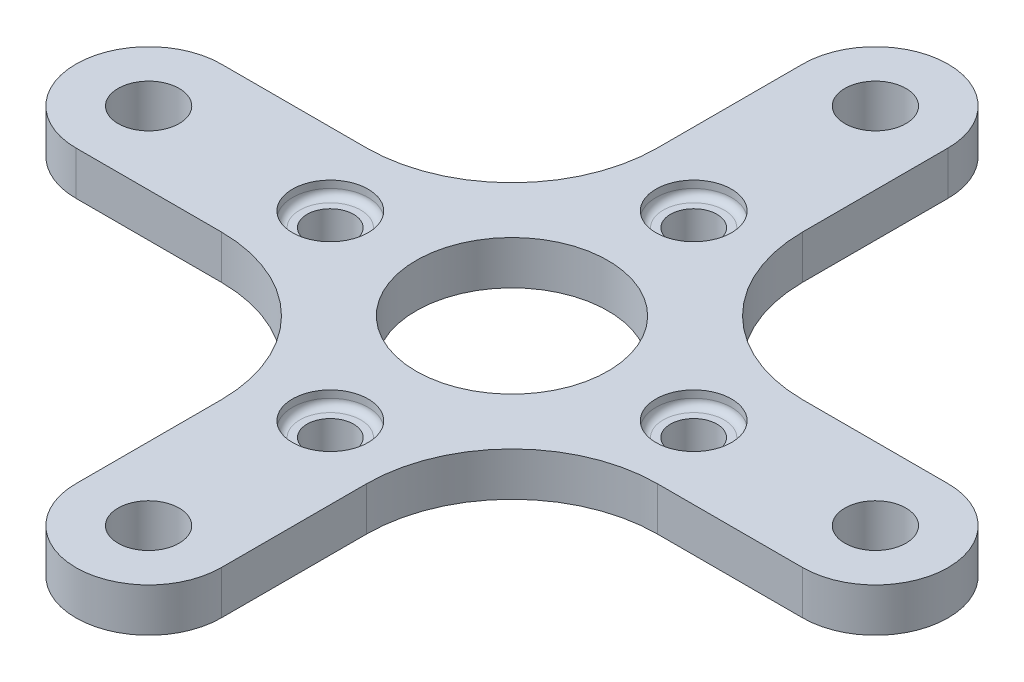
ISO-10303-21;
HEADER;
FILE_DESCRIPTION(('STEP AP214'),'2;1');
FILE_NAME('part.step','',(''),(''),'','','');
FILE_SCHEMA(('AUTOMOTIVE_DESIGN { 1 0 10303 214 1 1 1 1 }'));
ENDSEC;
DATA;
#1=APPLICATION_CONTEXT('core data for automotive mechanical design processes');
#2=APPLICATION_PROTOCOL_DEFINITION('international standard','automotive_design',2000,#1);
#3=PRODUCT_CONTEXT('',#1,'mechanical');
#4=PRODUCT('Part','Part','',(#3));
#5=PRODUCT_RELATED_PRODUCT_CATEGORY('part','',(#4));
#6=PRODUCT_DEFINITION_FORMATION('','',#4);
#7=PRODUCT_DEFINITION_CONTEXT('part definition',#1,'design');
#8=PRODUCT_DEFINITION('design','',#6,#7);
#9=PRODUCT_DEFINITION_SHAPE('','',#8);
#10=(LENGTH_UNIT() NAMED_UNIT(*) SI_UNIT(.MILLI.,.METRE.));
#11=(NAMED_UNIT(*) PLANE_ANGLE_UNIT() SI_UNIT($,.RADIAN.));
#12=(NAMED_UNIT(*) SI_UNIT($,.STERADIAN.) SOLID_ANGLE_UNIT());
#13=UNCERTAINTY_MEASURE_WITH_UNIT(LENGTH_MEASURE(1.E-05),#10,'distance_accuracy_value','');
#14=(GEOMETRIC_REPRESENTATION_CONTEXT(3) GLOBAL_UNCERTAINTY_ASSIGNED_CONTEXT((#13)) GLOBAL_UNIT_ASSIGNED_CONTEXT((#10,
#11,#12)) REPRESENTATION_CONTEXT('',''));
#15=CARTESIAN_POINT('',(0.,0.,0.));
#16=DIRECTION('',(0.,0.,1.));
#17=DIRECTION('',(1.,0.,0.));
#18=AXIS2_PLACEMENT_3D('',#15,#16,#17);
#19=CARTESIAN_POINT('',(0.,3.,-12.5));
#20=DIRECTION('',(0.,-1.,0.));
#21=DIRECTION('',(0.,0.,-1.));
#22=AXIS2_PLACEMENT_3D('',#19,#20,#21);
#23=CYLINDRICAL_SURFACE('',#22,1.6);
#24=CARTESIAN_POINT('',(0.,0.,-12.5));
#25=DIRECTION('',(0.,1.,0.));
#26=DIRECTION('',(0.,0.,1.));
#27=AXIS2_PLACEMENT_3D('',#24,#25,#26);
#28=CIRCLE('',#27,1.6);
#29=CARTESIAN_POINT('',(0.,0.,-10.9));
#30=VERTEX_POINT('',#29);
#31=EDGE_CURVE('E268',#30,#30,#28,.T.);
#32=ORIENTED_EDGE('',*,*,#31,.F.);
#33=EDGE_LOOP('',(#32));
#34=FACE_BOUND('',#33,.T.);
#35=CARTESIAN_POINT('',(0.,2.,-12.5));
#36=DIRECTION('',(0.,1.,0.));
#37=DIRECTION('',(0.,0.,1.));
#38=AXIS2_PLACEMENT_3D('',#35,#36,#37);
#39=CIRCLE('',#38,1.6);
#40=CARTESIAN_POINT('',(0.,2.,-10.9));
#41=VERTEX_POINT('',#40);
#42=EDGE_CURVE('E454',#41,#41,#39,.T.);
#43=ORIENTED_EDGE('',*,*,#42,.T.);
#44=EDGE_LOOP('',(#43));
#45=FACE_BOUND('',#44,.T.);
#46=ADVANCED_FACE('F41',(#34,#45),#23,.F.);
#47=CARTESIAN_POINT('',(12.5,3.,0.));
#48=DIRECTION('',(0.,-1.,0.));
#49=DIRECTION('',(0.,0.,-1.));
#50=AXIS2_PLACEMENT_3D('',#47,#48,#49);
#51=CYLINDRICAL_SURFACE('',#50,1.6);
#52=CARTESIAN_POINT('',(12.5,0.,0.));
#53=DIRECTION('',(0.,1.,0.));
#54=DIRECTION('',(0.,0.,1.));
#55=AXIS2_PLACEMENT_3D('',#52,#53,#54);
#56=CIRCLE('',#55,1.6);
#57=CARTESIAN_POINT('',(12.5,0.,1.60000000000004));
#58=VERTEX_POINT('',#57);
#59=EDGE_CURVE('E265',#58,#58,#56,.T.);
#60=ORIENTED_EDGE('',*,*,#59,.F.);
#61=EDGE_LOOP('',(#60));
#62=FACE_BOUND('',#61,.T.);
#63=CARTESIAN_POINT('',(12.5,2.,0.));
#64=DIRECTION('',(0.,1.,0.));
#65=DIRECTION('',(0.,0.,1.));
#66=AXIS2_PLACEMENT_3D('',#63,#64,#65);
#67=CIRCLE('',#66,1.6);
#68=CARTESIAN_POINT('',(12.5,2.,1.60000000000004));
#69=VERTEX_POINT('',#68);
#70=EDGE_CURVE('E452',#69,#69,#67,.T.);
#71=ORIENTED_EDGE('',*,*,#70,.T.);
#72=EDGE_LOOP('',(#71));
#73=FACE_BOUND('',#72,.T.);
#74=ADVANCED_FACE('F334',(#62,#73),#51,.F.);
#75=CARTESIAN_POINT('',(0.,3.,12.5));
#76=DIRECTION('',(0.,-1.,0.));
#77=DIRECTION('',(0.,0.,-1.));
#78=AXIS2_PLACEMENT_3D('',#75,#76,#77);
#79=CYLINDRICAL_SURFACE('',#78,1.6);
#80=CARTESIAN_POINT('',(0.,0.,12.5));
#81=DIRECTION('',(0.,1.,0.));
#82=DIRECTION('',(0.,0.,1.));
#83=AXIS2_PLACEMENT_3D('',#80,#81,#82);
#84=CIRCLE('',#83,1.6);
#85=CARTESIAN_POINT('',(0.,0.,14.1));
#86=VERTEX_POINT('',#85);
#87=EDGE_CURVE('E262',#86,#86,#84,.T.);
#88=ORIENTED_EDGE('',*,*,#87,.F.);
#89=EDGE_LOOP('',(#88));
#90=FACE_BOUND('',#89,.T.);
#91=CARTESIAN_POINT('',(0.,2.,12.5));
#92=DIRECTION('',(0.,1.,0.));
#93=DIRECTION('',(0.,0.,1.));
#94=AXIS2_PLACEMENT_3D('',#91,#92,#93);
#95=CIRCLE('',#94,1.6);
#96=CARTESIAN_POINT('',(0.,2.,14.1));
#97=VERTEX_POINT('',#96);
#98=EDGE_CURVE('E460',#97,#97,#95,.T.);
#99=ORIENTED_EDGE('',*,*,#98,.T.);
#100=EDGE_LOOP('',(#99));
#101=FACE_BOUND('',#100,.T.);
#102=ADVANCED_FACE('F341',(#90,#101),#79,.F.);
#103=CARTESIAN_POINT('',(-12.5,3.,-1.30930550206618E-13));
#104=DIRECTION('',(0.,-1.,0.));
#105=DIRECTION('',(0.,0.,-1.));
#106=AXIS2_PLACEMENT_3D('',#103,#104,#105);
#107=CYLINDRICAL_SURFACE('',#106,1.6);
#108=CARTESIAN_POINT('',(-12.5,0.,-1.30930550206618E-13));
#109=DIRECTION('',(0.,1.,0.));
#110=DIRECTION('',(0.,0.,1.));
#111=AXIS2_PLACEMENT_3D('',#108,#109,#110);
#112=CIRCLE('',#111,1.6);
#113=CARTESIAN_POINT('',(-12.5,0.,1.59999999999987));
#114=VERTEX_POINT('',#113);
#115=EDGE_CURVE('E259',#114,#114,#112,.T.);
#116=ORIENTED_EDGE('',*,*,#115,.F.);
#117=EDGE_LOOP('',(#116));
#118=FACE_BOUND('',#117,.T.);
#119=CARTESIAN_POINT('',(-12.5,2.,-1.30930550206618E-13));
#120=DIRECTION('',(0.,1.,0.));
#121=DIRECTION('',(0.,0.,1.));
#122=AXIS2_PLACEMENT_3D('',#119,#120,#121);
#123=CIRCLE('',#122,1.6);
#124=CARTESIAN_POINT('',(-12.5,2.,1.59999999999987));
#125=VERTEX_POINT('',#124);
#126=EDGE_CURVE('E467',#125,#125,#123,.T.);
#127=ORIENTED_EDGE('',*,*,#126,.T.);
#128=EDGE_LOOP('',(#127));
#129=FACE_BOUND('',#128,.T.);
#130=ADVANCED_FACE('F352',(#118,#129),#107,.F.);
#131=CARTESIAN_POINT('',(-24.999999999997,3.,1.8580927577482E-12));
#132=DIRECTION('',(0.,-1.,0.));
#133=DIRECTION('',(0.,0.,-1.));
#134=AXIS2_PLACEMENT_3D('',#131,#132,#133);
#135=CYLINDRICAL_SURFACE('',#134,5.);
#136=CARTESIAN_POINT('',(-24.999999999997,0.,1.8580927577482E-12));
#137=DIRECTION('',(0.,1.,0.));
#138=DIRECTION('',(0.,0.,1.));
#139=AXIS2_PLACEMENT_3D('',#136,#137,#138);
#140=CIRCLE('',#139,5.);
#141=CARTESIAN_POINT('',(-24.999999999997,0.,5.00000000000186));
#142=VERTEX_POINT('',#141);
#143=CARTESIAN_POINT('',(-24.999999999997,0.,-4.99999999999814));
#144=VERTEX_POINT('',#143);
#145=EDGE_CURVE('E202',#142,#144,#140,.F.);
#146=ORIENTED_EDGE('',*,*,#145,.F.);
#147=DIRECTION('',(0.,-1.,0.));
#148=VECTOR('',#147,1.);
#149=CARTESIAN_POINT('',(-24.999999999997,3.,5.00000000000186));
#150=LINE('',#149,#148);
#151=CARTESIAN_POINT('',(-24.999999999997,3.,5.00000000000186));
#152=VERTEX_POINT('',#151);
#153=EDGE_CURVE('E118',#152,#142,#150,.T.);
#154=ORIENTED_EDGE('',*,*,#153,.F.);
#155=CARTESIAN_POINT('',(-24.999999999997,3.,1.8580927577482E-12));
#156=DIRECTION('',(0.,1.,0.));
#157=DIRECTION('',(0.,0.,1.));
#158=AXIS2_PLACEMENT_3D('',#155,#156,#157);
#159=CIRCLE('',#158,5.);
#160=CARTESIAN_POINT('',(-24.999999999997,3.,-4.99999999999814));
#161=VERTEX_POINT('',#160);
#162=EDGE_CURVE('E274',#152,#161,#159,.F.);
#163=ORIENTED_EDGE('',*,*,#162,.T.);
#164=DIRECTION('',(0.,-1.,0.));
#165=VECTOR('',#164,1.);
#166=CARTESIAN_POINT('',(-24.999999999997,3.,-4.99999999999814));
#167=LINE('',#166,#165);
#168=EDGE_CURVE('E58',#161,#144,#167,.T.);
#169=ORIENTED_EDGE('',*,*,#168,.T.);
#170=EDGE_LOOP('',(#146,#154,#163,#169));
#171=FACE_BOUND('',#170,.T.);
#172=ADVANCED_FACE('F356',(#171),#135,.T.);
#173=CARTESIAN_POINT('',(0.,3.,5.00000000000186));
#174=DIRECTION('',(0.,0.,-1.));
#175=DIRECTION('',(-1.,0.,0.));
#176=AXIS2_PLACEMENT_3D('',#173,#174,#175);
#177=PLANE('',#176);
#178=DIRECTION('',(1.,0.,0.));
#179=VECTOR('',#178,1.);
#180=CARTESIAN_POINT('',(0.,0.,5.00000000000186));
#181=LINE('',#180,#179);
#182=CARTESIAN_POINT('',(-14.999999999997,0.,5.00000000000186));
#183=VERTEX_POINT('',#182);
#184=EDGE_CURVE('E204',#142,#183,#181,.T.);
#185=ORIENTED_EDGE('',*,*,#184,.T.);
#186=DIRECTION('',(0.,-1.,0.));
#187=VECTOR('',#186,1.);
#188=CARTESIAN_POINT('',(-14.999999999997,3.,5.00000000000186));
#189=LINE('',#188,#187);
#190=CARTESIAN_POINT('',(-14.999999999997,3.,5.00000000000186));
#191=VERTEX_POINT('',#190);
#192=EDGE_CURVE('E298',#191,#183,#189,.T.);
#193=ORIENTED_EDGE('',*,*,#192,.F.);
#194=DIRECTION('',(1.,0.,0.));
#195=VECTOR('',#194,1.);
#196=CARTESIAN_POINT('',(0.,3.,5.00000000000186));
#197=LINE('',#196,#195);
#198=EDGE_CURVE('E476',#152,#191,#197,.T.);
#199=ORIENTED_EDGE('',*,*,#198,.F.);
#200=ORIENTED_EDGE('',*,*,#153,.T.);
#201=EDGE_LOOP('',(#185,#193,#199,#200));
#202=FACE_BOUND('',#201,.T.);
#203=ADVANCED_FACE('F424',(#202),#177,.F.);
#204=CARTESIAN_POINT('',(-14.9999999999953,3.,14.9999999999989));
#205=DIRECTION('',(0.,-1.,0.));
#206=DIRECTION('',(0.,0.,-1.));
#207=AXIS2_PLACEMENT_3D('',#204,#205,#206);
#208=CYLINDRICAL_SURFACE('',#207,10.0000000000002);
#209=CARTESIAN_POINT('',(-14.9999999999953,0.,14.9999999999989));
#210=DIRECTION('',(0.,1.,0.));
#211=DIRECTION('',(0.,0.,1.));
#212=AXIS2_PLACEMENT_3D('',#209,#210,#211);
#213=CIRCLE('',#212,10.0000000000002);
#214=CARTESIAN_POINT('',(-4.99999999999517,0.,14.9999999999989));
#215=VERTEX_POINT('',#214);
#216=EDGE_CURVE('E208',#215,#183,#213,.T.);
#217=ORIENTED_EDGE('',*,*,#216,.F.);
#218=DIRECTION('',(0.,-1.,0.));
#219=VECTOR('',#218,1.);
#220=CARTESIAN_POINT('',(-4.99999999999517,3.,14.9999999999989));
#221=LINE('',#220,#219);
#222=CARTESIAN_POINT('',(-4.99999999999517,3.,14.9999999999989));
#223=VERTEX_POINT('',#222);
#224=EDGE_CURVE('E296',#223,#215,#221,.T.);
#225=ORIENTED_EDGE('',*,*,#224,.F.);
#226=CARTESIAN_POINT('',(-14.9999999999953,3.,14.9999999999989));
#227=DIRECTION('',(0.,1.,0.));
#228=DIRECTION('',(0.,0.,1.));
#229=AXIS2_PLACEMENT_3D('',#226,#227,#228);
#230=CIRCLE('',#229,10.0000000000002);
#231=EDGE_CURVE('E478',#223,#191,#230,.T.);
#232=ORIENTED_EDGE('',*,*,#231,.T.);
#233=ORIENTED_EDGE('',*,*,#192,.T.);
#234=EDGE_LOOP('',(#217,#225,#232,#233));
#235=FACE_BOUND('',#234,.T.);
#236=ADVANCED_FACE('F420',(#235),#208,.F.);
#237=CARTESIAN_POINT('',(-4.99999999999517,3.,0.));
#238=DIRECTION('',(-1.,0.,0.));
#239=DIRECTION('',(0.,0.,1.));
#240=AXIS2_PLACEMENT_3D('',#237,#238,#239);
#241=PLANE('',#240);
#242=DIRECTION('',(0.,0.,-1.));
#243=VECTOR('',#242,1.);
#244=CARTESIAN_POINT('',(-4.99999999999517,0.,0.));
#245=LINE('',#244,#243);
#246=CARTESIAN_POINT('',(-4.99999999999517,0.,24.9999999999989));
#247=VERTEX_POINT('',#246);
#248=EDGE_CURVE('E211',#247,#215,#245,.T.);
#249=ORIENTED_EDGE('',*,*,#248,.F.);
#250=DIRECTION('',(0.,-1.,0.));
#251=VECTOR('',#250,1.);
#252=CARTESIAN_POINT('',(-4.99999999999517,3.,24.9999999999989));
#253=LINE('',#252,#251);
#254=CARTESIAN_POINT('',(-4.99999999999517,3.,24.9999999999989));
#255=VERTEX_POINT('',#254);
#256=EDGE_CURVE('E294',#255,#247,#253,.T.);
#257=ORIENTED_EDGE('',*,*,#256,.F.);
#258=DIRECTION('',(0.,0.,-1.));
#259=VECTOR('',#258,1.);
#260=CARTESIAN_POINT('',(-4.99999999999517,3.,0.));
#261=LINE('',#260,#259);
#262=EDGE_CURVE('E481',#255,#223,#261,.T.);
#263=ORIENTED_EDGE('',*,*,#262,.T.);
#264=ORIENTED_EDGE('',*,*,#224,.T.);
#265=EDGE_LOOP('',(#249,#257,#263,#264));
#266=FACE_BOUND('',#265,.T.);
#267=ADVANCED_FACE('F416',(#266),#241,.T.);
#268=CARTESIAN_POINT('',(4.8325317741173E-12,3.,24.9999999999989));
#269=DIRECTION('',(0.,-1.,0.));
#270=DIRECTION('',(0.,0.,-1.));
#271=AXIS2_PLACEMENT_3D('',#268,#269,#270);
#272=CYLINDRICAL_SURFACE('',#271,5.);
#273=CARTESIAN_POINT('',(4.8325317741173E-12,0.,24.9999999999989));
#274=DIRECTION('',(0.,1.,0.));
#275=DIRECTION('',(0.,0.,1.));
#276=AXIS2_PLACEMENT_3D('',#273,#274,#275);
#277=CIRCLE('',#276,5.);
#278=CARTESIAN_POINT('',(5.00000000000483,0.,24.9999999999989));
#279=VERTEX_POINT('',#278);
#280=EDGE_CURVE('E214',#279,#247,#277,.F.);
#281=ORIENTED_EDGE('',*,*,#280,.F.);
#282=DIRECTION('',(0.,-1.,0.));
#283=VECTOR('',#282,1.);
#284=CARTESIAN_POINT('',(5.00000000000483,3.,24.9999999999989));
#285=LINE('',#284,#283);
#286=CARTESIAN_POINT('',(5.00000000000483,3.,24.9999999999989));
#287=VERTEX_POINT('',#286);
#288=EDGE_CURVE('E292',#287,#279,#285,.T.);
#289=ORIENTED_EDGE('',*,*,#288,.F.);
#290=CARTESIAN_POINT('',(4.8325317741173E-12,3.,24.9999999999989));
#291=DIRECTION('',(0.,1.,0.));
#292=DIRECTION('',(0.,0.,1.));
#293=AXIS2_PLACEMENT_3D('',#290,#291,#292);
#294=CIRCLE('',#293,5.);
#295=EDGE_CURVE('E484',#287,#255,#294,.F.);
#296=ORIENTED_EDGE('',*,*,#295,.T.);
#297=ORIENTED_EDGE('',*,*,#256,.T.);
#298=EDGE_LOOP('',(#281,#289,#296,#297));
#299=FACE_BOUND('',#298,.T.);
#300=ADVANCED_FACE('F412',(#299),#272,.T.);
#301=CARTESIAN_POINT('',(5.00000000000483,3.,0.));
#302=DIRECTION('',(-1.,0.,0.));
#303=DIRECTION('',(0.,0.,1.));
#304=AXIS2_PLACEMENT_3D('',#301,#302,#303);
#305=PLANE('',#304);
#306=DIRECTION('',(0.,0.,-1.));
#307=VECTOR('',#306,1.);
#308=CARTESIAN_POINT('',(5.00000000000483,0.,0.));
#309=LINE('',#308,#307);
#310=CARTESIAN_POINT('',(5.00000000000483,0.,14.9999999999989));
#311=VERTEX_POINT('',#310);
#312=EDGE_CURVE('E217',#279,#311,#309,.T.);
#313=ORIENTED_EDGE('',*,*,#312,.T.);
#314=DIRECTION('',(0.,-1.,0.));
#315=VECTOR('',#314,1.);
#316=CARTESIAN_POINT('',(5.00000000000483,3.,14.9999999999989));
#317=LINE('',#316,#315);
#318=CARTESIAN_POINT('',(5.00000000000483,3.,14.9999999999989));
#319=VERTEX_POINT('',#318);
#320=EDGE_CURVE('E290',#319,#311,#317,.T.);
#321=ORIENTED_EDGE('',*,*,#320,.F.);
#322=DIRECTION('',(0.,0.,-1.));
#323=VECTOR('',#322,1.);
#324=CARTESIAN_POINT('',(5.00000000000483,3.,0.));
#325=LINE('',#324,#323);
#326=EDGE_CURVE('E487',#287,#319,#325,.T.);
#327=ORIENTED_EDGE('',*,*,#326,.F.);
#328=ORIENTED_EDGE('',*,*,#288,.T.);
#329=EDGE_LOOP('',(#313,#321,#327,#328));
#330=FACE_BOUND('',#329,.T.);
#331=ADVANCED_FACE('F408',(#330),#305,.F.);
#332=CARTESIAN_POINT('',(15.0000000000019,3.,14.9999999999972));
#333=DIRECTION('',(0.,-1.,0.));
#334=DIRECTION('',(0.,0.,-1.));
#335=AXIS2_PLACEMENT_3D('',#332,#333,#334);
#336=CYLINDRICAL_SURFACE('',#335,10.0000000000002);
#337=CARTESIAN_POINT('',(15.0000000000019,0.,14.9999999999972));
#338=DIRECTION('',(0.,1.,0.));
#339=DIRECTION('',(0.,0.,1.));
#340=AXIS2_PLACEMENT_3D('',#337,#338,#339);
#341=CIRCLE('',#340,10.0000000000002);
#342=CARTESIAN_POINT('',(15.0000000000019,0.,4.99999999999703));
#343=VERTEX_POINT('',#342);
#344=EDGE_CURVE('E220',#343,#311,#341,.T.);
#345=ORIENTED_EDGE('',*,*,#344,.F.);
#346=DIRECTION('',(0.,-1.,0.));
#347=VECTOR('',#346,1.);
#348=CARTESIAN_POINT('',(15.0000000000019,3.,4.99999999999703));
#349=LINE('',#348,#347);
#350=CARTESIAN_POINT('',(15.0000000000019,3.,4.99999999999703));
#351=VERTEX_POINT('',#350);
#352=EDGE_CURVE('E288',#351,#343,#349,.T.);
#353=ORIENTED_EDGE('',*,*,#352,.F.);
#354=CARTESIAN_POINT('',(15.0000000000019,3.,14.9999999999972));
#355=DIRECTION('',(0.,1.,0.));
#356=DIRECTION('',(0.,0.,1.));
#357=AXIS2_PLACEMENT_3D('',#354,#355,#356);
#358=CIRCLE('',#357,10.0000000000002);
#359=EDGE_CURVE('E489',#351,#319,#358,.T.);
#360=ORIENTED_EDGE('',*,*,#359,.T.);
#361=ORIENTED_EDGE('',*,*,#320,.T.);
#362=EDGE_LOOP('',(#345,#353,#360,#361));
#363=FACE_BOUND('',#362,.T.);
#364=ADVANCED_FACE('F404',(#363),#336,.F.);
#365=CARTESIAN_POINT('',(0.,3.,4.99999999999703));
#366=DIRECTION('',(0.,0.,1.));
#367=DIRECTION('',(1.,0.,0.));
#368=AXIS2_PLACEMENT_3D('',#365,#366,#367);
#369=PLANE('',#368);
#370=DIRECTION('',(-1.,0.,0.));
#371=VECTOR('',#370,1.);
#372=CARTESIAN_POINT('',(0.,0.,4.99999999999703));
#373=LINE('',#372,#371);
#374=CARTESIAN_POINT('',(25.0000000000019,0.,4.99999999999703));
#375=VERTEX_POINT('',#374);
#376=EDGE_CURVE('E223',#375,#343,#373,.T.);
#377=ORIENTED_EDGE('',*,*,#376,.F.);
#378=DIRECTION('',(0.,-1.,0.));
#379=VECTOR('',#378,1.);
#380=CARTESIAN_POINT('',(25.0000000000019,3.,4.99999999999703));
#381=LINE('',#380,#379);
#382=CARTESIAN_POINT('',(25.0000000000019,3.,4.99999999999703));
#383=VERTEX_POINT('',#382);
#384=EDGE_CURVE('E286',#383,#375,#381,.T.);
#385=ORIENTED_EDGE('',*,*,#384,.F.);
#386=DIRECTION('',(-1.,0.,0.));
#387=VECTOR('',#386,1.);
#388=CARTESIAN_POINT('',(0.,3.,4.99999999999703));
#389=LINE('',#388,#387);
#390=EDGE_CURVE('E492',#383,#351,#389,.T.);
#391=ORIENTED_EDGE('',*,*,#390,.T.);
#392=ORIENTED_EDGE('',*,*,#352,.T.);
#393=EDGE_LOOP('',(#377,#385,#391,#392));
#394=FACE_BOUND('',#393,.T.);
#395=ADVANCED_FACE('F400',(#394),#369,.T.);
#396=CARTESIAN_POINT('',(25.0000000000019,3.,-2.97137739937123E-12));
#397=DIRECTION('',(0.,-1.,0.));
#398=DIRECTION('',(0.,0.,-1.));
#399=AXIS2_PLACEMENT_3D('',#396,#397,#398);
#400=CYLINDRICAL_SURFACE('',#399,5.);
#401=CARTESIAN_POINT('',(25.0000000000019,0.,-2.97137739937123E-12));
#402=DIRECTION('',(0.,1.,0.));
#403=DIRECTION('',(0.,0.,1.));
#404=AXIS2_PLACEMENT_3D('',#401,#402,#403);
#405=CIRCLE('',#404,5.);
#406=CARTESIAN_POINT('',(25.0000000000019,0.,-5.00000000000297));
#407=VERTEX_POINT('',#406);
#408=EDGE_CURVE('E226',#407,#375,#405,.F.);
#409=ORIENTED_EDGE('',*,*,#408,.F.);
#410=DIRECTION('',(0.,-1.,0.));
#411=VECTOR('',#410,1.);
#412=CARTESIAN_POINT('',(25.0000000000019,3.,-5.00000000000297));
#413=LINE('',#412,#411);
#414=CARTESIAN_POINT('',(25.0000000000019,3.,-5.00000000000297));
#415=VERTEX_POINT('',#414);
#416=EDGE_CURVE('E284',#415,#407,#413,.T.);
#417=ORIENTED_EDGE('',*,*,#416,.F.);
#418=CARTESIAN_POINT('',(25.0000000000019,3.,-2.97137739937123E-12));
#419=DIRECTION('',(0.,1.,0.));
#420=DIRECTION('',(0.,0.,1.));
#421=AXIS2_PLACEMENT_3D('',#418,#419,#420);
#422=CIRCLE('',#421,5.);
#423=EDGE_CURVE('E495',#415,#383,#422,.F.);
#424=ORIENTED_EDGE('',*,*,#423,.T.);
#425=ORIENTED_EDGE('',*,*,#384,.T.);
#426=EDGE_LOOP('',(#409,#417,#424,#425));
#427=FACE_BOUND('',#426,.T.);
#428=ADVANCED_FACE('F396',(#427),#400,.T.);
#429=CARTESIAN_POINT('',(0.,3.,-5.00000000000297));
#430=DIRECTION('',(0.,0.,1.));
#431=DIRECTION('',(1.,0.,0.));
#432=AXIS2_PLACEMENT_3D('',#429,#430,#431);
#433=PLANE('',#432);
#434=DIRECTION('',(-1.,0.,0.));
#435=VECTOR('',#434,1.);
#436=CARTESIAN_POINT('',(0.,0.,-5.00000000000297));
#437=LINE('',#436,#435);
#438=CARTESIAN_POINT('',(15.0000000000019,0.,-5.00000000000297));
#439=VERTEX_POINT('',#438);
#440=EDGE_CURVE('E229',#407,#439,#437,.T.);
#441=ORIENTED_EDGE('',*,*,#440,.T.);
#442=DIRECTION('',(0.,-1.,0.));
#443=VECTOR('',#442,1.);
#444=CARTESIAN_POINT('',(15.0000000000019,3.,-5.00000000000297));
#445=LINE('',#444,#443);
#446=CARTESIAN_POINT('',(15.0000000000019,3.,-5.00000000000297));
#447=VERTEX_POINT('',#446);
#448=EDGE_CURVE('E282',#447,#439,#445,.T.);
#449=ORIENTED_EDGE('',*,*,#448,.F.);
#450=DIRECTION('',(-1.,0.,0.));
#451=VECTOR('',#450,1.);
#452=CARTESIAN_POINT('',(0.,3.,-5.00000000000297));
#453=LINE('',#452,#451);
#454=EDGE_CURVE('E498',#415,#447,#453,.T.);
#455=ORIENTED_EDGE('',*,*,#454,.F.);
#456=ORIENTED_EDGE('',*,*,#416,.T.);
#457=EDGE_LOOP('',(#441,#449,#455,#456));
#458=FACE_BOUND('',#457,.T.);
#459=ADVANCED_FACE('F392',(#458),#433,.F.);
#460=CARTESIAN_POINT('',(15.0000000000002,3.,-15.));
#461=DIRECTION('',(0.,-1.,0.));
#462=DIRECTION('',(0.,0.,-1.));
#463=AXIS2_PLACEMENT_3D('',#460,#461,#462);
#464=CYLINDRICAL_SURFACE('',#463,10.0000000000002);
#465=CARTESIAN_POINT('',(15.0000000000002,0.,-15.));
#466=DIRECTION('',(0.,1.,0.));
#467=DIRECTION('',(0.,0.,1.));
#468=AXIS2_PLACEMENT_3D('',#465,#466,#467);
#469=CIRCLE('',#468,10.0000000000002);
#470=CARTESIAN_POINT('',(5.,0.,-15.));
#471=VERTEX_POINT('',#470);
#472=EDGE_CURVE('E232',#471,#439,#469,.T.);
#473=ORIENTED_EDGE('',*,*,#472,.F.);
#474=DIRECTION('',(0.,-1.,0.));
#475=VECTOR('',#474,1.);
#476=CARTESIAN_POINT('',(5.,3.,-15.));
#477=LINE('',#476,#475);
#478=CARTESIAN_POINT('',(5.,3.,-15.));
#479=VERTEX_POINT('',#478);
#480=EDGE_CURVE('E280',#479,#471,#477,.T.);
#481=ORIENTED_EDGE('',*,*,#480,.F.);
#482=CARTESIAN_POINT('',(15.0000000000002,3.,-15.));
#483=DIRECTION('',(0.,1.,0.));
#484=DIRECTION('',(0.,0.,1.));
#485=AXIS2_PLACEMENT_3D('',#482,#483,#484);
#486=CIRCLE('',#485,10.0000000000002);
#487=EDGE_CURVE('E500',#479,#447,#486,.T.);
#488=ORIENTED_EDGE('',*,*,#487,.T.);
#489=ORIENTED_EDGE('',*,*,#448,.T.);
#490=EDGE_LOOP('',(#473,#481,#488,#489));
#491=FACE_BOUND('',#490,.T.);
#492=ADVANCED_FACE('F388',(#491),#464,.F.);
#493=CARTESIAN_POINT('',(5.,3.,0.));
#494=DIRECTION('',(1.,0.,0.));
#495=DIRECTION('',(0.,0.,-1.));
#496=AXIS2_PLACEMENT_3D('',#493,#494,#495);
#497=PLANE('',#496);
#498=DIRECTION('',(0.,0.,1.));
#499=VECTOR('',#498,1.);
#500=CARTESIAN_POINT('',(5.,0.,0.));
#501=LINE('',#500,#499);
#502=CARTESIAN_POINT('',(5.,0.,-25.));
#503=VERTEX_POINT('',#502);
#504=EDGE_CURVE('E235',#503,#471,#501,.T.);
#505=ORIENTED_EDGE('',*,*,#504,.F.);
#506=DIRECTION('',(0.,-1.,0.));
#507=VECTOR('',#506,1.);
#508=CARTESIAN_POINT('',(5.,3.,-25.));
#509=LINE('',#508,#507);
#510=CARTESIAN_POINT('',(5.,3.,-25.));
#511=VERTEX_POINT('',#510);
#512=EDGE_CURVE('E278',#511,#503,#509,.T.);
#513=ORIENTED_EDGE('',*,*,#512,.F.);
#514=DIRECTION('',(0.,0.,1.));
#515=VECTOR('',#514,1.);
#516=CARTESIAN_POINT('',(5.,3.,0.));
#517=LINE('',#516,#515);
#518=EDGE_CURVE('E503',#511,#479,#517,.T.);
#519=ORIENTED_EDGE('',*,*,#518,.T.);
#520=ORIENTED_EDGE('',*,*,#480,.T.);
#521=EDGE_LOOP('',(#505,#513,#519,#520));
#522=FACE_BOUND('',#521,.T.);
#523=ADVANCED_FACE('F384',(#522),#497,.T.);
#524=CARTESIAN_POINT('',(0.,3.,-25.));
#525=DIRECTION('',(0.,-1.,0.));
#526=DIRECTION('',(0.,0.,-1.));
#527=AXIS2_PLACEMENT_3D('',#524,#525,#526);
#528=CYLINDRICAL_SURFACE('',#527,5.);
#529=CARTESIAN_POINT('',(0.,0.,-25.));
#530=DIRECTION('',(0.,1.,0.));
#531=DIRECTION('',(0.,0.,1.));
#532=AXIS2_PLACEMENT_3D('',#529,#530,#531);
#533=CIRCLE('',#532,5.);
#534=CARTESIAN_POINT('',(-5.,0.,-25.));
#535=VERTEX_POINT('',#534);
#536=EDGE_CURVE('E238',#535,#503,#533,.F.);
#537=ORIENTED_EDGE('',*,*,#536,.F.);
#538=DIRECTION('',(0.,-1.,0.));
#539=VECTOR('',#538,1.);
#540=CARTESIAN_POINT('',(-5.,3.,-25.));
#541=LINE('',#540,#539);
#542=CARTESIAN_POINT('',(-5.,3.,-25.));
#543=VERTEX_POINT('',#542);
#544=EDGE_CURVE('E179',#543,#535,#541,.T.);
#545=ORIENTED_EDGE('',*,*,#544,.F.);
#546=CARTESIAN_POINT('',(0.,3.,-25.));
#547=DIRECTION('',(0.,1.,0.));
#548=DIRECTION('',(0.,0.,1.));
#549=AXIS2_PLACEMENT_3D('',#546,#547,#548);
#550=CIRCLE('',#549,5.);
#551=EDGE_CURVE('E169',#543,#511,#550,.F.);
#552=ORIENTED_EDGE('',*,*,#551,.T.);
#553=ORIENTED_EDGE('',*,*,#512,.T.);
#554=EDGE_LOOP('',(#537,#545,#552,#553));
#555=FACE_BOUND('',#554,.T.);
#556=ADVANCED_FACE('F381',(#555),#528,.T.);
#557=CARTESIAN_POINT('',(-5.,3.,0.));
#558=DIRECTION('',(1.,0.,0.));
#559=DIRECTION('',(0.,0.,-1.));
#560=AXIS2_PLACEMENT_3D('',#557,#558,#559);
#561=PLANE('',#560);
#562=DIRECTION('',(0.,0.,1.));
#563=VECTOR('',#562,1.);
#564=CARTESIAN_POINT('',(-5.,0.,0.));
#565=LINE('',#564,#563);
#566=CARTESIAN_POINT('',(-5.,0.,-15.));
#567=VERTEX_POINT('',#566);
#568=EDGE_CURVE('E176',#535,#567,#565,.T.);
#569=ORIENTED_EDGE('',*,*,#568,.T.);
#570=DIRECTION('',(0.,-1.,0.));
#571=VECTOR('',#570,1.);
#572=CARTESIAN_POINT('',(-5.,3.,-15.));
#573=LINE('',#572,#571);
#574=CARTESIAN_POINT('',(-5.,3.,-15.));
#575=VERTEX_POINT('',#574);
#576=EDGE_CURVE('E173',#575,#567,#573,.T.);
#577=ORIENTED_EDGE('',*,*,#576,.F.);
#578=DIRECTION('',(0.,0.,1.));
#579=VECTOR('',#578,1.);
#580=CARTESIAN_POINT('',(-5.,3.,0.));
#581=LINE('',#580,#579);
#582=EDGE_CURVE('E159',#543,#575,#581,.T.);
#583=ORIENTED_EDGE('',*,*,#582,.F.);
#584=ORIENTED_EDGE('',*,*,#544,.T.);
#585=EDGE_LOOP('',(#569,#577,#583,#584));
#586=FACE_BOUND('',#585,.T.);
#587=ADVANCED_FACE('F174',(#586),#561,.F.);
#588=CARTESIAN_POINT('',(-15.0000000000002,3.,-15.));
#589=DIRECTION('',(0.,-1.,0.));
#590=DIRECTION('',(0.,0.,-1.));
#591=AXIS2_PLACEMENT_3D('',#588,#589,#590);
#592=CYLINDRICAL_SURFACE('',#591,10.0000000000002);
#593=CARTESIAN_POINT('',(-15.0000000000002,0.,-15.));
#594=DIRECTION('',(0.,1.,0.));
#595=DIRECTION('',(0.,0.,1.));
#596=AXIS2_PLACEMENT_3D('',#593,#594,#595);
#597=CIRCLE('',#596,10.0000000000002);
#598=CARTESIAN_POINT('',(-14.999999999997,0.,-4.99999999999814));
#599=VERTEX_POINT('',#598);
#600=EDGE_CURVE('E242',#567,#599,#597,.F.);
#601=ORIENTED_EDGE('',*,*,#600,.T.);
#602=DIRECTION('',(0.,-1.,0.));
#603=VECTOR('',#602,1.);
#604=CARTESIAN_POINT('',(-14.999999999997,3.,-4.99999999999814));
#605=LINE('',#604,#603);
#606=CARTESIAN_POINT('',(-14.999999999997,3.,-4.99999999999814));
#607=VERTEX_POINT('',#606);
#608=EDGE_CURVE('E109',#607,#599,#605,.T.);
#609=ORIENTED_EDGE('',*,*,#608,.F.);
#610=CARTESIAN_POINT('',(-15.0000000000002,3.,-15.));
#611=DIRECTION('',(0.,1.,0.));
#612=DIRECTION('',(0.,0.,1.));
#613=AXIS2_PLACEMENT_3D('',#610,#611,#612);
#614=CIRCLE('',#613,10.0000000000002);
#615=EDGE_CURVE('E166',#575,#607,#614,.F.);
#616=ORIENTED_EDGE('',*,*,#615,.F.);
#617=ORIENTED_EDGE('',*,*,#576,.T.);
#618=EDGE_LOOP('',(#601,#609,#616,#617));
#619=FACE_BOUND('',#618,.T.);
#620=ADVANCED_FACE('F181',(#619),#592,.F.);
#621=CARTESIAN_POINT('',(0.,3.,-25.));
#622=DIRECTION('',(0.,-1.,0.));
#623=DIRECTION('',(0.,0.,-1.));
#624=AXIS2_PLACEMENT_3D('',#621,#622,#623);
#625=CYLINDRICAL_SURFACE('',#624,2.1);
#626=CARTESIAN_POINT('',(0.,3.,-25.));
#627=DIRECTION('',(0.,1.,0.));
#628=DIRECTION('',(0.,0.,1.));
#629=AXIS2_PLACEMENT_3D('',#626,#627,#628);
#630=CIRCLE('',#629,2.1);
#631=CARTESIAN_POINT('',(0.,3.,-22.9));
#632=VERTEX_POINT('',#631);
#633=EDGE_CURVE('E196',#632,#632,#630,.T.);
#634=ORIENTED_EDGE('',*,*,#633,.T.);
#635=EDGE_LOOP('',(#634));
#636=FACE_BOUND('',#635,.T.);
#637=CARTESIAN_POINT('',(0.,0.,-25.));
#638=DIRECTION('',(0.,1.,0.));
#639=DIRECTION('',(0.,0.,1.));
#640=AXIS2_PLACEMENT_3D('',#637,#638,#639);
#641=CIRCLE('',#640,2.1);
#642=CARTESIAN_POINT('',(0.,0.,-22.9));
#643=VERTEX_POINT('',#642);
#644=EDGE_CURVE('E256',#643,#643,#641,.T.);
#645=ORIENTED_EDGE('',*,*,#644,.F.);
#646=EDGE_LOOP('',(#645));
#647=FACE_BOUND('',#646,.T.);
#648=ADVANCED_FACE('F358',(#636,#647),#625,.F.);
#649=CARTESIAN_POINT('',(25.,3.,0.));
#650=DIRECTION('',(0.,-1.,0.));
#651=DIRECTION('',(0.,0.,-1.));
#652=AXIS2_PLACEMENT_3D('',#649,#650,#651);
#653=CYLINDRICAL_SURFACE('',#652,2.1);
#654=CARTESIAN_POINT('',(25.,3.,0.));
#655=DIRECTION('',(0.,1.,0.));
#656=DIRECTION('',(0.,0.,1.));
#657=AXIS2_PLACEMENT_3D('',#654,#655,#656);
#658=CIRCLE('',#657,2.1);
#659=CARTESIAN_POINT('',(25.,3.,2.10000000000009));
#660=VERTEX_POINT('',#659);
#661=EDGE_CURVE('E193',#660,#660,#658,.T.);
#662=ORIENTED_EDGE('',*,*,#661,.T.);
#663=EDGE_LOOP('',(#662));
#664=FACE_BOUND('',#663,.T.);
#665=CARTESIAN_POINT('',(25.,0.,0.));
#666=DIRECTION('',(0.,1.,0.));
#667=DIRECTION('',(0.,0.,1.));
#668=AXIS2_PLACEMENT_3D('',#665,#666,#667);
#669=CIRCLE('',#668,2.1);
#670=CARTESIAN_POINT('',(25.,0.,2.10000000000009));
#671=VERTEX_POINT('',#670);
#672=EDGE_CURVE('E253',#671,#671,#669,.T.);
#673=ORIENTED_EDGE('',*,*,#672,.F.);
#674=EDGE_LOOP('',(#673));
#675=FACE_BOUND('',#674,.T.);
#676=ADVANCED_FACE('F361',(#664,#675),#653,.F.);
#677=CARTESIAN_POINT('',(-1.74574066942157E-13,3.,25.));
#678=DIRECTION('',(0.,-1.,0.));
#679=DIRECTION('',(0.,0.,-1.));
#680=AXIS2_PLACEMENT_3D('',#677,#678,#679);
#681=CYLINDRICAL_SURFACE('',#680,2.1);
#682=CARTESIAN_POINT('',(-1.74574066942157E-13,3.,25.));
#683=DIRECTION('',(0.,1.,0.));
#684=DIRECTION('',(0.,0.,1.));
#685=AXIS2_PLACEMENT_3D('',#682,#683,#684);
#686=CIRCLE('',#685,2.1);
#687=CARTESIAN_POINT('',(-1.74574066942157E-13,3.,27.1));
#688=VERTEX_POINT('',#687);
#689=EDGE_CURVE('E190',#688,#688,#686,.T.);
#690=ORIENTED_EDGE('',*,*,#689,.T.);
#691=EDGE_LOOP('',(#690));
#692=FACE_BOUND('',#691,.T.);
#693=CARTESIAN_POINT('',(-1.74574066942157E-13,0.,25.));
#694=DIRECTION('',(0.,1.,0.));
#695=DIRECTION('',(0.,0.,1.));
#696=AXIS2_PLACEMENT_3D('',#693,#694,#695);
#697=CIRCLE('',#696,2.1);
#698=CARTESIAN_POINT('',(-1.74574066942157E-13,0.,27.1));
#699=VERTEX_POINT('',#698);
#700=EDGE_CURVE('E250',#699,#699,#697,.T.);
#701=ORIENTED_EDGE('',*,*,#700,.F.);
#702=EDGE_LOOP('',(#701));
#703=FACE_BOUND('',#702,.T.);
#704=ADVANCED_FACE('F365',(#692,#703),#681,.F.);
#705=CARTESIAN_POINT('',(-25.,3.,-2.61861100413235E-13));
#706=DIRECTION('',(0.,-1.,0.));
#707=DIRECTION('',(0.,0.,-1.));
#708=AXIS2_PLACEMENT_3D('',#705,#706,#707);
#709=CYLINDRICAL_SURFACE('',#708,2.1);
#710=CARTESIAN_POINT('',(-25.,3.,-2.61861100413235E-13));
#711=DIRECTION('',(0.,1.,0.));
#712=DIRECTION('',(0.,0.,1.));
#713=AXIS2_PLACEMENT_3D('',#710,#711,#712);
#714=CIRCLE('',#713,2.1);
#715=CARTESIAN_POINT('',(-25.,3.,2.09999999999974));
#716=VERTEX_POINT('',#715);
#717=EDGE_CURVE('E184',#716,#716,#714,.T.);
#718=ORIENTED_EDGE('',*,*,#717,.T.);
#719=EDGE_LOOP('',(#718));
#720=FACE_BOUND('',#719,.T.);
#721=CARTESIAN_POINT('',(-25.,0.,-2.61861100413235E-13));
#722=DIRECTION('',(0.,1.,0.));
#723=DIRECTION('',(0.,0.,1.));
#724=AXIS2_PLACEMENT_3D('',#721,#722,#723);
#725=CIRCLE('',#724,2.1);
#726=CARTESIAN_POINT('',(-25.,0.,2.09999999999974));
#727=VERTEX_POINT('',#726);
#728=EDGE_CURVE('E247',#727,#727,#725,.T.);
#729=ORIENTED_EDGE('',*,*,#728,.F.);
#730=EDGE_LOOP('',(#729));
#731=FACE_BOUND('',#730,.T.);
#732=ADVANCED_FACE('F369',(#720,#731),#709,.F.);
#733=CARTESIAN_POINT('',(0.,3.,-4.99999999999814));
#734=DIRECTION('',(0.,0.,-1.));
#735=DIRECTION('',(-1.,0.,0.));
#736=AXIS2_PLACEMENT_3D('',#733,#734,#735);
#737=PLANE('',#736);
#738=DIRECTION('',(1.,0.,0.));
#739=VECTOR('',#738,1.);
#740=CARTESIAN_POINT('',(0.,0.,-4.99999999999814));
#741=LINE('',#740,#739);
#742=EDGE_CURVE('E244',#144,#599,#741,.T.);
#743=ORIENTED_EDGE('',*,*,#742,.F.);
#744=ORIENTED_EDGE('',*,*,#168,.F.);
#745=DIRECTION('',(1.,0.,0.));
#746=VECTOR('',#745,1.);
#747=CARTESIAN_POINT('',(0.,3.,-4.99999999999814));
#748=LINE('',#747,#746);
#749=EDGE_CURVE('E182',#161,#607,#748,.T.);
#750=ORIENTED_EDGE('',*,*,#749,.T.);
#751=ORIENTED_EDGE('',*,*,#608,.T.);
#752=EDGE_LOOP('',(#743,#744,#750,#751));
#753=FACE_BOUND('',#752,.T.);
#754=ADVANCED_FACE('F373',(#753),#737,.T.);
#755=CARTESIAN_POINT('',(0.,3.,0.));
#756=DIRECTION('',(0.,-1.,0.));
#757=DIRECTION('',(0.,0.,-1.));
#758=AXIS2_PLACEMENT_3D('',#755,#756,#757);
#759=CYLINDRICAL_SURFACE('',#758,6.6);
#760=CARTESIAN_POINT('',(0.,3.,0.));
#761=DIRECTION('',(0.,1.,0.));
#762=DIRECTION('',(0.,0.,1.));
#763=AXIS2_PLACEMENT_3D('',#760,#761,#762);
#764=CIRCLE('',#763,6.6);
#765=CARTESIAN_POINT('',(0.,3.,6.6));
#766=VERTEX_POINT('',#765);
#767=EDGE_CURVE('E199',#766,#766,#764,.T.);
#768=ORIENTED_EDGE('',*,*,#767,.T.);
#769=EDGE_LOOP('',(#768));
#770=FACE_BOUND('',#769,.T.);
#771=CARTESIAN_POINT('',(0.,0.,0.));
#772=DIRECTION('',(0.,1.,0.));
#773=DIRECTION('',(0.,0.,1.));
#774=AXIS2_PLACEMENT_3D('',#771,#772,#773);
#775=CIRCLE('',#774,6.6);
#776=CARTESIAN_POINT('',(0.,0.,6.6));
#777=VERTEX_POINT('',#776);
#778=EDGE_CURVE('E271',#777,#777,#775,.T.);
#779=ORIENTED_EDGE('',*,*,#778,.F.);
#780=EDGE_LOOP('',(#779));
#781=FACE_BOUND('',#780,.T.);
#782=ADVANCED_FACE('F347',(#770,#781),#759,.F.);
#783=CARTESIAN_POINT('',(0.,3.,0.));
#784=DIRECTION('',(0.,1.,0.));
#785=DIRECTION('',(0.,0.,1.));
#786=AXIS2_PLACEMENT_3D('',#783,#784,#785);
#787=PLANE('',#786);
#788=CARTESIAN_POINT('',(0.,3.,-12.5));
#789=DIRECTION('',(0.,1.,0.));
#790=DIRECTION('',(0.,0.,1.));
#791=AXIS2_PLACEMENT_3D('',#788,#789,#790);
#792=CIRCLE('',#791,2.6);
#793=CARTESIAN_POINT('',(0.,3.,-9.9));
#794=VERTEX_POINT('',#793);
#795=EDGE_CURVE('E205',#794,#794,#792,.T.);
#796=ORIENTED_EDGE('',*,*,#795,.F.);
#797=EDGE_LOOP('',(#796));
#798=FACE_BOUND('',#797,.T.);
#799=CARTESIAN_POINT('',(12.5,3.,0.));
#800=DIRECTION('',(0.,1.,0.));
#801=DIRECTION('',(0.,0.,1.));
#802=AXIS2_PLACEMENT_3D('',#799,#800,#801);
#803=CIRCLE('',#802,2.6);
#804=CARTESIAN_POINT('',(12.5,3.,2.60000000000004));
#805=VERTEX_POINT('',#804);
#806=EDGE_CURVE('E455',#805,#805,#803,.T.);
#807=ORIENTED_EDGE('',*,*,#806,.F.);
#808=EDGE_LOOP('',(#807));
#809=FACE_BOUND('',#808,.T.);
#810=CARTESIAN_POINT('',(0.,3.,12.5));
#811=DIRECTION('',(0.,1.,0.));
#812=DIRECTION('',(0.,0.,1.));
#813=AXIS2_PLACEMENT_3D('',#810,#811,#812);
#814=CIRCLE('',#813,2.6);
#815=CARTESIAN_POINT('',(0.,3.,15.1));
#816=VERTEX_POINT('',#815);
#817=EDGE_CURVE('E464',#816,#816,#814,.T.);
#818=ORIENTED_EDGE('',*,*,#817,.F.);
#819=EDGE_LOOP('',(#818));
#820=FACE_BOUND('',#819,.T.);
#821=CARTESIAN_POINT('',(-12.5,3.,-1.30930550206618E-13));
#822=DIRECTION('',(0.,1.,0.));
#823=DIRECTION('',(0.,0.,1.));
#824=AXIS2_PLACEMENT_3D('',#821,#822,#823);
#825=CIRCLE('',#824,2.6);
#826=CARTESIAN_POINT('',(-12.5,3.,2.59999999999987));
#827=VERTEX_POINT('',#826);
#828=EDGE_CURVE('E470',#827,#827,#825,.T.);
#829=ORIENTED_EDGE('',*,*,#828,.F.);
#830=EDGE_LOOP('',(#829));
#831=FACE_BOUND('',#830,.T.);
#832=ORIENTED_EDGE('',*,*,#162,.F.);
#833=ORIENTED_EDGE('',*,*,#198,.T.);
#834=ORIENTED_EDGE('',*,*,#231,.F.);
#835=ORIENTED_EDGE('',*,*,#262,.F.);
#836=ORIENTED_EDGE('',*,*,#295,.F.);
#837=ORIENTED_EDGE('',*,*,#326,.T.);
#838=ORIENTED_EDGE('',*,*,#359,.F.);
#839=ORIENTED_EDGE('',*,*,#390,.F.);
#840=ORIENTED_EDGE('',*,*,#423,.F.);
#841=ORIENTED_EDGE('',*,*,#454,.T.);
#842=ORIENTED_EDGE('',*,*,#487,.F.);
#843=ORIENTED_EDGE('',*,*,#518,.F.);
#844=ORIENTED_EDGE('',*,*,#551,.F.);
#845=ORIENTED_EDGE('',*,*,#582,.T.);
#846=ORIENTED_EDGE('',*,*,#615,.T.);
#847=ORIENTED_EDGE('',*,*,#749,.F.);
#848=EDGE_LOOP('',(#832,#833,#834,#835,#836,#837,#838,#839,#840,#841,#842,#843,#844,#845,#846,#847));
#849=FACE_BOUND('',#848,.T.);
#850=ORIENTED_EDGE('',*,*,#717,.F.);
#851=EDGE_LOOP('',(#850));
#852=FACE_BOUND('',#851,.T.);
#853=ORIENTED_EDGE('',*,*,#689,.F.);
#854=EDGE_LOOP('',(#853));
#855=FACE_BOUND('',#854,.T.);
#856=ORIENTED_EDGE('',*,*,#661,.F.);
#857=EDGE_LOOP('',(#856));
#858=FACE_BOUND('',#857,.T.);
#859=ORIENTED_EDGE('',*,*,#633,.F.);
#860=EDGE_LOOP('',(#859));
#861=FACE_BOUND('',#860,.T.);
#862=ORIENTED_EDGE('',*,*,#767,.F.);
#863=EDGE_LOOP('',(#862));
#864=FACE_BOUND('',#863,.T.);
#865=ADVANCED_FACE('F162',(#798,#809,#820,#831,#849,#852,#855,#858,#861,#864),#787,.T.);
#866=CARTESIAN_POINT('',(0.,0.,0.));
#867=DIRECTION('',(0.,1.,0.));
#868=DIRECTION('',(0.,0.,1.));
#869=AXIS2_PLACEMENT_3D('',#866,#867,#868);
#870=PLANE('',#869);
#871=ORIENTED_EDGE('',*,*,#145,.T.);
#872=ORIENTED_EDGE('',*,*,#742,.T.);
#873=ORIENTED_EDGE('',*,*,#600,.F.);
#874=ORIENTED_EDGE('',*,*,#568,.F.);
#875=ORIENTED_EDGE('',*,*,#536,.T.);
#876=ORIENTED_EDGE('',*,*,#504,.T.);
#877=ORIENTED_EDGE('',*,*,#472,.T.);
#878=ORIENTED_EDGE('',*,*,#440,.F.);
#879=ORIENTED_EDGE('',*,*,#408,.T.);
#880=ORIENTED_EDGE('',*,*,#376,.T.);
#881=ORIENTED_EDGE('',*,*,#344,.T.);
#882=ORIENTED_EDGE('',*,*,#312,.F.);
#883=ORIENTED_EDGE('',*,*,#280,.T.);
#884=ORIENTED_EDGE('',*,*,#248,.T.);
#885=ORIENTED_EDGE('',*,*,#216,.T.);
#886=ORIENTED_EDGE('',*,*,#184,.F.);
#887=EDGE_LOOP('',(#871,#872,#873,#874,#875,#876,#877,#878,#879,#880,#881,#882,#883,#884,#885,#886));
#888=FACE_BOUND('',#887,.T.);
#889=ORIENTED_EDGE('',*,*,#728,.T.);
#890=EDGE_LOOP('',(#889));
#891=FACE_BOUND('',#890,.T.);
#892=ORIENTED_EDGE('',*,*,#700,.T.);
#893=EDGE_LOOP('',(#892));
#894=FACE_BOUND('',#893,.T.);
#895=ORIENTED_EDGE('',*,*,#672,.T.);
#896=EDGE_LOOP('',(#895));
#897=FACE_BOUND('',#896,.T.);
#898=ORIENTED_EDGE('',*,*,#644,.T.);
#899=EDGE_LOOP('',(#898));
#900=FACE_BOUND('',#899,.T.);
#901=ORIENTED_EDGE('',*,*,#115,.T.);
#902=EDGE_LOOP('',(#901));
#903=FACE_BOUND('',#902,.T.);
#904=ORIENTED_EDGE('',*,*,#87,.T.);
#905=EDGE_LOOP('',(#904));
#906=FACE_BOUND('',#905,.T.);
#907=ORIENTED_EDGE('',*,*,#59,.T.);
#908=EDGE_LOOP('',(#907));
#909=FACE_BOUND('',#908,.T.);
#910=ORIENTED_EDGE('',*,*,#31,.T.);
#911=EDGE_LOOP('',(#910));
#912=FACE_BOUND('',#911,.T.);
#913=ORIENTED_EDGE('',*,*,#778,.T.);
#914=EDGE_LOOP('',(#913));
#915=FACE_BOUND('',#914,.T.);
#916=ADVANCED_FACE('F508',(#888,#891,#894,#897,#900,#903,#906,#909,#912,#915),#870,.F.);
#917=CARTESIAN_POINT('',(-12.5,2.,-1.30930550206618E-13));
#918=DIRECTION('',(0.,1.,0.));
#919=DIRECTION('',(0.,0.,1.));
#920=AXIS2_PLACEMENT_3D('',#917,#918,#919);
#921=CYLINDRICAL_SURFACE('',#920,2.6);
#922=CARTESIAN_POINT('',(-12.5,2.5,-1.30930550206618E-13));
#923=DIRECTION('',(0.,1.,0.));
#924=DIRECTION('',(0.,0.,1.));
#925=AXIS2_PLACEMENT_3D('',#922,#923,#924);
#926=CIRCLE('',#925,2.6);
#927=CARTESIAN_POINT('',(-12.5,2.5,2.59999999999987));
#928=VERTEX_POINT('',#927);
#929=EDGE_CURVE('E11',#928,#928,#926,.F.);
#930=ORIENTED_EDGE('',*,*,#929,.T.);
#931=EDGE_LOOP('',(#930));
#932=FACE_BOUND('',#931,.T.);
#933=ORIENTED_EDGE('',*,*,#828,.T.);
#934=EDGE_LOOP('',(#933));
#935=FACE_BOUND('',#934,.T.);
#936=ADVANCED_FACE('F532',(#932,#935),#921,.F.);
#937=CARTESIAN_POINT('',(-12.5,2.,-1.30930550206618E-13));
#938=DIRECTION('',(0.,1.,0.));
#939=DIRECTION('',(0.,0.,1.));
#940=AXIS2_PLACEMENT_3D('',#937,#938,#939);
#941=PLANE('',#940);
#942=CARTESIAN_POINT('',(-12.5,2.,-1.30930550206618E-13));
#943=DIRECTION('',(0.,1.,0.));
#944=DIRECTION('',(0.,0.,1.));
#945=AXIS2_PLACEMENT_3D('',#942,#943,#944);
#946=CIRCLE('',#945,2.1);
#947=CARTESIAN_POINT('',(-12.5,2.,2.09999999999987));
#948=VERTEX_POINT('',#947);
#949=EDGE_CURVE('E50',#948,#948,#946,.T.);
#950=ORIENTED_EDGE('',*,*,#949,.T.);
#951=EDGE_LOOP('',(#950));
#952=FACE_BOUND('',#951,.T.);
#953=ORIENTED_EDGE('',*,*,#126,.F.);
#954=EDGE_LOOP('',(#953));
#955=FACE_BOUND('',#954,.T.);
#956=ADVANCED_FACE('F321',(#952,#955),#941,.T.);
#957=CARTESIAN_POINT('',(0.,2.,12.5));
#958=DIRECTION('',(0.,1.,0.));
#959=DIRECTION('',(0.,0.,1.));
#960=AXIS2_PLACEMENT_3D('',#957,#958,#959);
#961=CYLINDRICAL_SURFACE('',#960,2.6);
#962=CARTESIAN_POINT('',(0.,2.5,12.5));
#963=DIRECTION('',(0.,1.,0.));
#964=DIRECTION('',(0.,0.,1.));
#965=AXIS2_PLACEMENT_3D('',#962,#963,#964);
#966=CIRCLE('',#965,2.6);
#967=CARTESIAN_POINT('',(0.,2.5,15.1));
#968=VERTEX_POINT('',#967);
#969=EDGE_CURVE('E304',#968,#968,#966,.F.);
#970=ORIENTED_EDGE('',*,*,#969,.T.);
#971=EDGE_LOOP('',(#970));
#972=FACE_BOUND('',#971,.T.);
#973=ORIENTED_EDGE('',*,*,#817,.T.);
#974=EDGE_LOOP('',(#973));
#975=FACE_BOUND('',#974,.T.);
#976=ADVANCED_FACE('F567',(#972,#975),#961,.F.);
#977=CARTESIAN_POINT('',(0.,2.,12.5));
#978=DIRECTION('',(0.,1.,0.));
#979=DIRECTION('',(0.,0.,1.));
#980=AXIS2_PLACEMENT_3D('',#977,#978,#979);
#981=PLANE('',#980);
#982=CARTESIAN_POINT('',(0.,2.,12.5));
#983=DIRECTION('',(0.,1.,0.));
#984=DIRECTION('',(0.,0.,1.));
#985=AXIS2_PLACEMENT_3D('',#982,#983,#984);
#986=CIRCLE('',#985,2.1);
#987=CARTESIAN_POINT('',(0.,2.,14.6));
#988=VERTEX_POINT('',#987);
#989=EDGE_CURVE('E301',#988,#988,#986,.T.);
#990=ORIENTED_EDGE('',*,*,#989,.T.);
#991=EDGE_LOOP('',(#990));
#992=FACE_BOUND('',#991,.T.);
#993=ORIENTED_EDGE('',*,*,#98,.F.);
#994=EDGE_LOOP('',(#993));
#995=FACE_BOUND('',#994,.T.);
#996=ADVANCED_FACE('F570',(#992,#995),#981,.T.);
#997=CARTESIAN_POINT('',(12.5,2.,0.));
#998=DIRECTION('',(0.,1.,0.));
#999=DIRECTION('',(0.,0.,1.));
#1000=AXIS2_PLACEMENT_3D('',#997,#998,#999);
#1001=CYLINDRICAL_SURFACE('',#1000,2.6);
#1002=CARTESIAN_POINT('',(12.5,2.5,0.));
#1003=DIRECTION('',(0.,1.,0.));
#1004=DIRECTION('',(0.,0.,1.));
#1005=AXIS2_PLACEMENT_3D('',#1002,#1003,#1004);
#1006=CIRCLE('',#1005,2.6);
#1007=CARTESIAN_POINT('',(12.5,2.5,2.60000000000004));
#1008=VERTEX_POINT('',#1007);
#1009=EDGE_CURVE('E310',#1008,#1008,#1006,.F.);
#1010=ORIENTED_EDGE('',*,*,#1009,.T.);
#1011=EDGE_LOOP('',(#1010));
#1012=FACE_BOUND('',#1011,.T.);
#1013=ORIENTED_EDGE('',*,*,#806,.T.);
#1014=EDGE_LOOP('',(#1013));
#1015=FACE_BOUND('',#1014,.T.);
#1016=ADVANCED_FACE('F448',(#1012,#1015),#1001,.F.);
#1017=CARTESIAN_POINT('',(12.5,2.,0.));
#1018=DIRECTION('',(0.,1.,0.));
#1019=DIRECTION('',(0.,0.,1.));
#1020=AXIS2_PLACEMENT_3D('',#1017,#1018,#1019);
#1021=PLANE('',#1020);
#1022=CARTESIAN_POINT('',(12.5,2.,0.));
#1023=DIRECTION('',(0.,1.,0.));
#1024=DIRECTION('',(0.,0.,1.));
#1025=AXIS2_PLACEMENT_3D('',#1022,#1023,#1024);
#1026=CIRCLE('',#1025,2.1);
#1027=CARTESIAN_POINT('',(12.5,2.,2.10000000000004));
#1028=VERTEX_POINT('',#1027);
#1029=EDGE_CURVE('E307',#1028,#1028,#1026,.T.);
#1030=ORIENTED_EDGE('',*,*,#1029,.T.);
#1031=EDGE_LOOP('',(#1030));
#1032=FACE_BOUND('',#1031,.T.);
#1033=ORIENTED_EDGE('',*,*,#70,.F.);
#1034=EDGE_LOOP('',(#1033));
#1035=FACE_BOUND('',#1034,.T.);
#1036=ADVANCED_FACE('F444',(#1032,#1035),#1021,.T.);
#1037=CARTESIAN_POINT('',(0.,2.,-12.5));
#1038=DIRECTION('',(0.,1.,0.));
#1039=DIRECTION('',(0.,0.,1.));
#1040=AXIS2_PLACEMENT_3D('',#1037,#1038,#1039);
#1041=CYLINDRICAL_SURFACE('',#1040,2.6);
#1042=CARTESIAN_POINT('',(0.,2.5,-12.5));
#1043=DIRECTION('',(0.,1.,0.));
#1044=DIRECTION('',(0.,0.,1.));
#1045=AXIS2_PLACEMENT_3D('',#1042,#1043,#1044);
#1046=CIRCLE('',#1045,2.6);
#1047=CARTESIAN_POINT('',(0.,2.5,-9.9));
#1048=VERTEX_POINT('',#1047);
#1049=EDGE_CURVE('E316',#1048,#1048,#1046,.F.);
#1050=ORIENTED_EDGE('',*,*,#1049,.T.);
#1051=EDGE_LOOP('',(#1050));
#1052=FACE_BOUND('',#1051,.T.);
#1053=ORIENTED_EDGE('',*,*,#795,.T.);
#1054=EDGE_LOOP('',(#1053));
#1055=FACE_BOUND('',#1054,.T.);
#1056=ADVANCED_FACE('F447',(#1052,#1055),#1041,.F.);
#1057=CARTESIAN_POINT('',(0.,2.,-12.5));
#1058=DIRECTION('',(0.,1.,0.));
#1059=DIRECTION('',(0.,0.,1.));
#1060=AXIS2_PLACEMENT_3D('',#1057,#1058,#1059);
#1061=PLANE('',#1060);
#1062=CARTESIAN_POINT('',(0.,2.,-12.5));
#1063=DIRECTION('',(0.,1.,0.));
#1064=DIRECTION('',(0.,0.,1.));
#1065=AXIS2_PLACEMENT_3D('',#1062,#1063,#1064);
#1066=CIRCLE('',#1065,2.1);
#1067=CARTESIAN_POINT('',(0.,2.,-10.4));
#1068=VERTEX_POINT('',#1067);
#1069=EDGE_CURVE('E313',#1068,#1068,#1066,.T.);
#1070=ORIENTED_EDGE('',*,*,#1069,.T.);
#1071=EDGE_LOOP('',(#1070));
#1072=FACE_BOUND('',#1071,.T.);
#1073=ORIENTED_EDGE('',*,*,#42,.F.);
#1074=EDGE_LOOP('',(#1073));
#1075=FACE_BOUND('',#1074,.T.);
#1076=ADVANCED_FACE('F434',(#1072,#1075),#1061,.T.);
#1077=CARTESIAN_POINT('',(0.,2.5,12.5));
#1078=DIRECTION('',(0.,1.,0.));
#1079=DIRECTION('',(0.,0.,1.));
#1080=AXIS2_PLACEMENT_3D('',#1077,#1078,#1079);
#1081=TOROIDAL_SURFACE('',#1080,2.1,0.5);
#1082=ORIENTED_EDGE('',*,*,#969,.F.);
#1083=EDGE_LOOP('',(#1082));
#1084=FACE_BOUND('',#1083,.T.);
#1085=ORIENTED_EDGE('',*,*,#989,.F.);
#1086=EDGE_LOOP('',(#1085));
#1087=FACE_BOUND('',#1086,.T.);
#1088=ADVANCED_FACE('F431',(#1084,#1087),#1081,.F.);
#1089=CARTESIAN_POINT('',(12.5,2.5,0.));
#1090=DIRECTION('',(0.,1.,0.));
#1091=DIRECTION('',(0.,0.,1.));
#1092=AXIS2_PLACEMENT_3D('',#1089,#1090,#1091);
#1093=TOROIDAL_SURFACE('',#1092,2.1,0.5);
#1094=ORIENTED_EDGE('',*,*,#1009,.F.);
#1095=EDGE_LOOP('',(#1094));
#1096=FACE_BOUND('',#1095,.T.);
#1097=ORIENTED_EDGE('',*,*,#1029,.F.);
#1098=EDGE_LOOP('',(#1097));
#1099=FACE_BOUND('',#1098,.T.);
#1100=ADVANCED_FACE('F330',(#1096,#1099),#1093,.F.);
#1101=CARTESIAN_POINT('',(0.,2.5,-12.5));
#1102=DIRECTION('',(0.,1.,0.));
#1103=DIRECTION('',(0.,0.,1.));
#1104=AXIS2_PLACEMENT_3D('',#1101,#1102,#1103);
#1105=TOROIDAL_SURFACE('',#1104,2.1,0.5);
#1106=ORIENTED_EDGE('',*,*,#1049,.F.);
#1107=EDGE_LOOP('',(#1106));
#1108=FACE_BOUND('',#1107,.T.);
#1109=ORIENTED_EDGE('',*,*,#1069,.F.);
#1110=EDGE_LOOP('',(#1109));
#1111=FACE_BOUND('',#1110,.T.);
#1112=ADVANCED_FACE('F325',(#1108,#1111),#1105,.F.);
#1113=CARTESIAN_POINT('',(-12.5,2.5,-1.30930550206618E-13));
#1114=DIRECTION('',(0.,1.,0.));
#1115=DIRECTION('',(0.,0.,1.));
#1116=AXIS2_PLACEMENT_3D('',#1113,#1114,#1115);
#1117=TOROIDAL_SURFACE('',#1116,2.1,0.5);
#1118=ORIENTED_EDGE('',*,*,#929,.F.);
#1119=EDGE_LOOP('',(#1118));
#1120=FACE_BOUND('',#1119,.T.);
#1121=ORIENTED_EDGE('',*,*,#949,.F.);
#1122=EDGE_LOOP('',(#1121));
#1123=FACE_BOUND('',#1122,.T.);
#1124=ADVANCED_FACE('F43',(#1120,#1123),#1117,.F.);
#1125=CLOSED_SHELL('',(#46,#74,#102,#130,#172,#203,#236,#267,#300,#331,#364,#395,#428,#459,#492,
#523,#556,#587,#620,#648,#676,#704,#732,#754,#782,#865,#916,#936,#956,#976,#996,#1016,#1036,
#1056,#1076,#1088,#1100,#1112,#1124));
#1126=MANIFOLD_SOLID_BREP('B2',#1125);
#1127=ADVANCED_BREP_SHAPE_REPRESENTATION('',(#18,#1126),#14);
#1128=SHAPE_DEFINITION_REPRESENTATION(#9,#1127);
ENDSEC;
END-ISO-10303-21;
